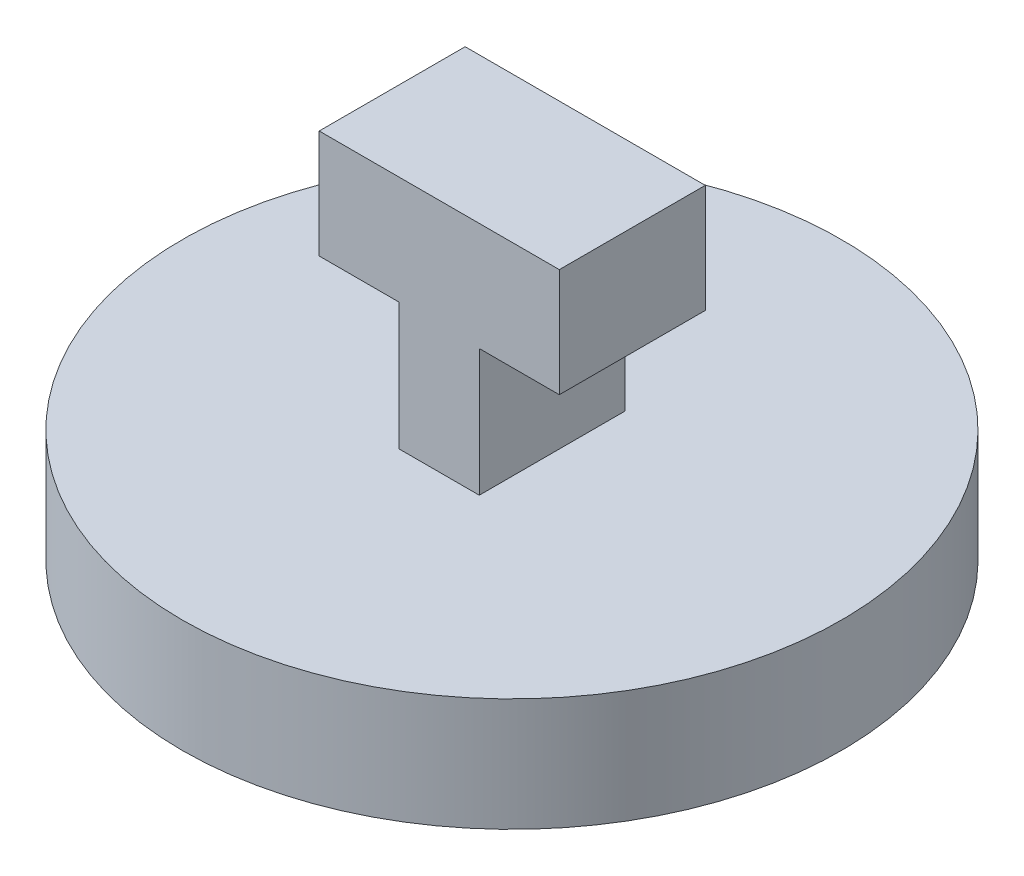
ISO-10303-21;
HEADER;
FILE_DESCRIPTION(('STEP AP214'),'2;1');
FILE_NAME('part.step','',(''),(''),'','','');
FILE_SCHEMA(('AUTOMOTIVE_DESIGN { 1 0 10303 214 1 1 1 1 }'));
ENDSEC;
DATA;
#1=APPLICATION_CONTEXT('core data for automotive mechanical design processes');
#2=APPLICATION_PROTOCOL_DEFINITION('international standard','automotive_design',2000,#1);
#3=PRODUCT_CONTEXT('',#1,'mechanical');
#4=PRODUCT('Part','Part','',(#3));
#5=PRODUCT_RELATED_PRODUCT_CATEGORY('part','',(#4));
#6=PRODUCT_DEFINITION_FORMATION('','',#4);
#7=PRODUCT_DEFINITION_CONTEXT('part definition',#1,'design');
#8=PRODUCT_DEFINITION('design','',#6,#7);
#9=PRODUCT_DEFINITION_SHAPE('','',#8);
#10=(LENGTH_UNIT() NAMED_UNIT(*) SI_UNIT(.MILLI.,.METRE.));
#11=(NAMED_UNIT(*) PLANE_ANGLE_UNIT() SI_UNIT($,.RADIAN.));
#12=(NAMED_UNIT(*) SI_UNIT($,.STERADIAN.) SOLID_ANGLE_UNIT());
#13=UNCERTAINTY_MEASURE_WITH_UNIT(LENGTH_MEASURE(1.E-05),#10,'distance_accuracy_value','');
#14=(GEOMETRIC_REPRESENTATION_CONTEXT(3) GLOBAL_UNCERTAINTY_ASSIGNED_CONTEXT((#13)) GLOBAL_UNIT_ASSIGNED_CONTEXT((#10,
#11,#12)) REPRESENTATION_CONTEXT('',''));
#15=CARTESIAN_POINT('',(0.,0.,0.));
#16=DIRECTION('',(0.,0.,1.));
#17=DIRECTION('',(1.,0.,0.));
#18=AXIS2_PLACEMENT_3D('',#15,#16,#17);
#19=CARTESIAN_POINT('',(0.,2.4,0.));
#20=DIRECTION('',(0.,1.,0.));
#21=DIRECTION('',(0.,0.,1.));
#22=AXIS2_PLACEMENT_3D('',#19,#20,#21);
#23=PLANE('',#22);
#24=CARTESIAN_POINT('',(0.,2.4,0.));
#25=DIRECTION('',(0.,1.,0.));
#26=DIRECTION('',(0.,0.,1.));
#27=AXIS2_PLACEMENT_3D('',#24,#25,#26);
#28=CIRCLE('',#27,7.);
#29=CARTESIAN_POINT('',(0.,2.4,7.));
#30=VERTEX_POINT('',#29);
#31=EDGE_CURVE('E13',#30,#30,#28,.T.);
#32=ORIENTED_EDGE('',*,*,#31,.T.);
#33=EDGE_LOOP('',(#32));
#34=FACE_BOUND('',#33,.T.);
#35=DIRECTION('',(-1.,0.,0.));
#36=VECTOR('',#35,1.);
#37=CARTESIAN_POINT('',(0.,2.4,-1.55));
#38=LINE('',#37,#36);
#39=CARTESIAN_POINT('',(0.856552512765914,2.4,-1.55));
#40=VERTEX_POINT('',#39);
#41=CARTESIAN_POINT('',(-0.843447487234086,2.4,-1.55));
#42=VERTEX_POINT('',#41);
#43=EDGE_CURVE('E173',#40,#42,#38,.T.);
#44=ORIENTED_EDGE('',*,*,#43,.F.);
#45=DIRECTION('',(0.,0.,1.));
#46=VECTOR('',#45,1.);
#47=CARTESIAN_POINT('',(0.856552512765914,2.4,-1.55));
#48=LINE('',#47,#46);
#49=CARTESIAN_POINT('',(0.856552512765914,2.4,1.55));
#50=VERTEX_POINT('',#49);
#51=EDGE_CURVE('E77',#40,#50,#48,.T.);
#52=ORIENTED_EDGE('',*,*,#51,.T.);
#53=DIRECTION('',(-1.,0.,0.));
#54=VECTOR('',#53,1.);
#55=CARTESIAN_POINT('',(0.,2.4,1.55));
#56=LINE('',#55,#54);
#57=CARTESIAN_POINT('',(-0.843447487234086,2.4,1.55));
#58=VERTEX_POINT('',#57);
#59=EDGE_CURVE('E82',#50,#58,#56,.T.);
#60=ORIENTED_EDGE('',*,*,#59,.T.);
#61=DIRECTION('',(0.,0.,1.));
#62=VECTOR('',#61,1.);
#63=CARTESIAN_POINT('',(-0.843447487234086,2.4,-1.55));
#64=LINE('',#63,#62);
#65=EDGE_CURVE('E197',#42,#58,#64,.T.);
#66=ORIENTED_EDGE('',*,*,#65,.F.);
#67=EDGE_LOOP('',(#44,#52,#60,#66));
#68=FACE_BOUND('',#67,.T.);
#69=ADVANCED_FACE('F61',(#34,#68),#23,.T.);
#70=CARTESIAN_POINT('',(0.,2.4,0.));
#71=DIRECTION('',(0.,-1.,0.));
#72=DIRECTION('',(0.,0.,-1.));
#73=AXIS2_PLACEMENT_3D('',#70,#71,#72);
#74=CYLINDRICAL_SURFACE('',#73,7.);
#75=ORIENTED_EDGE('',*,*,#31,.F.);
#76=EDGE_LOOP('',(#75));
#77=FACE_BOUND('',#76,.T.);
#78=CARTESIAN_POINT('',(0.,0.,0.));
#79=DIRECTION('',(0.,1.,0.));
#80=DIRECTION('',(0.,0.,1.));
#81=AXIS2_PLACEMENT_3D('',#78,#79,#80);
#82=CIRCLE('',#81,7.);
#83=CARTESIAN_POINT('',(0.,0.,7.));
#84=VERTEX_POINT('',#83);
#85=EDGE_CURVE('E65',#84,#84,#82,.T.);
#86=ORIENTED_EDGE('',*,*,#85,.T.);
#87=EDGE_LOOP('',(#86));
#88=FACE_BOUND('',#87,.T.);
#89=ADVANCED_FACE('F63',(#77,#88),#74,.T.);
#90=CARTESIAN_POINT('',(0.,0.,0.));
#91=DIRECTION('',(0.,1.,0.));
#92=DIRECTION('',(0.,0.,1.));
#93=AXIS2_PLACEMENT_3D('',#90,#91,#92);
#94=PLANE('',#93);
#95=ORIENTED_EDGE('',*,*,#85,.F.);
#96=EDGE_LOOP('',(#95));
#97=FACE_BOUND('',#96,.T.);
#98=ADVANCED_FACE('F243',(#97),#94,.F.);
#99=CARTESIAN_POINT('',(-0.843447487234086,0.,-1.55));
#100=DIRECTION('',(1.,0.,0.));
#101=DIRECTION('',(0.,0.,-1.));
#102=AXIS2_PLACEMENT_3D('',#99,#100,#101);
#103=PLANE('',#102);
#104=ORIENTED_EDGE('',*,*,#65,.T.);
#105=DIRECTION('',(0.,1.,0.));
#106=VECTOR('',#105,1.);
#107=CARTESIAN_POINT('',(-0.843447487234086,0.,1.55));
#108=LINE('',#107,#106);
#109=CARTESIAN_POINT('',(-0.843447487234086,5.1,1.55));
#110=VERTEX_POINT('',#109);
#111=EDGE_CURVE('E169',#58,#110,#108,.T.);
#112=ORIENTED_EDGE('',*,*,#111,.T.);
#113=DIRECTION('',(0.,0.,1.));
#114=VECTOR('',#113,1.);
#115=CARTESIAN_POINT('',(-0.843447487234086,5.1,-1.55));
#116=LINE('',#115,#114);
#117=CARTESIAN_POINT('',(-0.843447487234086,5.1,-1.55));
#118=VERTEX_POINT('',#117);
#119=EDGE_CURVE('E200',#118,#110,#116,.T.);
#120=ORIENTED_EDGE('',*,*,#119,.F.);
#121=DIRECTION('',(0.,1.,0.));
#122=VECTOR('',#121,1.);
#123=CARTESIAN_POINT('',(-0.843447487234086,0.,-1.55));
#124=LINE('',#123,#122);
#125=EDGE_CURVE('E194',#42,#118,#124,.T.);
#126=ORIENTED_EDGE('',*,*,#125,.F.);
#127=EDGE_LOOP('',(#104,#112,#120,#126));
#128=FACE_BOUND('',#127,.T.);
#129=ADVANCED_FACE('F245',(#128),#103,.F.);
#130=CARTESIAN_POINT('',(0.,5.1,-1.55));
#131=DIRECTION('',(0.,1.,0.));
#132=DIRECTION('',(0.,0.,1.));
#133=AXIS2_PLACEMENT_3D('',#130,#131,#132);
#134=PLANE('',#133);
#135=ORIENTED_EDGE('',*,*,#119,.T.);
#136=DIRECTION('',(-1.,0.,0.));
#137=VECTOR('',#136,1.);
#138=CARTESIAN_POINT('',(0.,5.1,1.55));
#139=LINE('',#138,#137);
#140=CARTESIAN_POINT('',(-2.54344748723409,5.1,1.55));
#141=VERTEX_POINT('',#140);
#142=EDGE_CURVE('E165',#110,#141,#139,.T.);
#143=ORIENTED_EDGE('',*,*,#142,.T.);
#144=DIRECTION('',(0.,0.,1.));
#145=VECTOR('',#144,1.);
#146=CARTESIAN_POINT('',(-2.54344748723409,5.1,-1.55));
#147=LINE('',#146,#145);
#148=CARTESIAN_POINT('',(-2.54344748723409,5.1,-1.55));
#149=VERTEX_POINT('',#148);
#150=EDGE_CURVE('E203',#149,#141,#147,.T.);
#151=ORIENTED_EDGE('',*,*,#150,.F.);
#152=DIRECTION('',(-1.,0.,0.));
#153=VECTOR('',#152,1.);
#154=CARTESIAN_POINT('',(0.,5.1,-1.55));
#155=LINE('',#154,#153);
#156=EDGE_CURVE('E191',#118,#149,#155,.T.);
#157=ORIENTED_EDGE('',*,*,#156,.F.);
#158=EDGE_LOOP('',(#135,#143,#151,#157));
#159=FACE_BOUND('',#158,.T.);
#160=ADVANCED_FACE('F250',(#159),#134,.F.);
#161=CARTESIAN_POINT('',(-2.54344748723409,0.,-1.55));
#162=DIRECTION('',(1.,0.,0.));
#163=DIRECTION('',(0.,0.,-1.));
#164=AXIS2_PLACEMENT_3D('',#161,#162,#163);
#165=PLANE('',#164);
#166=ORIENTED_EDGE('',*,*,#150,.T.);
#167=DIRECTION('',(0.,1.,0.));
#168=VECTOR('',#167,1.);
#169=CARTESIAN_POINT('',(-2.54344748723409,0.,1.55));
#170=LINE('',#169,#168);
#171=CARTESIAN_POINT('',(-2.54344748723409,7.4,1.55));
#172=VERTEX_POINT('',#171);
#173=EDGE_CURVE('E161',#141,#172,#170,.T.);
#174=ORIENTED_EDGE('',*,*,#173,.T.);
#175=DIRECTION('',(0.,0.,1.));
#176=VECTOR('',#175,1.);
#177=CARTESIAN_POINT('',(-2.54344748723409,7.4,-1.55));
#178=LINE('',#177,#176);
#179=CARTESIAN_POINT('',(-2.54344748723409,7.4,-1.55));
#180=VERTEX_POINT('',#179);
#181=EDGE_CURVE('E206',#180,#172,#178,.T.);
#182=ORIENTED_EDGE('',*,*,#181,.F.);
#183=DIRECTION('',(0.,1.,0.));
#184=VECTOR('',#183,1.);
#185=CARTESIAN_POINT('',(-2.54344748723409,0.,-1.55));
#186=LINE('',#185,#184);
#187=EDGE_CURVE('E188',#149,#180,#186,.T.);
#188=ORIENTED_EDGE('',*,*,#187,.F.);
#189=EDGE_LOOP('',(#166,#174,#182,#188));
#190=FACE_BOUND('',#189,.T.);
#191=ADVANCED_FACE('F272',(#190),#165,.F.);
#192=CARTESIAN_POINT('',(0.,7.4,-1.55));
#193=DIRECTION('',(0.,-1.,0.));
#194=DIRECTION('',(0.,0.,-1.));
#195=AXIS2_PLACEMENT_3D('',#192,#193,#194);
#196=PLANE('',#195);
#197=ORIENTED_EDGE('',*,*,#181,.T.);
#198=DIRECTION('',(1.,0.,0.));
#199=VECTOR('',#198,1.);
#200=CARTESIAN_POINT('',(0.,7.4,1.55));
#201=LINE('',#200,#199);
#202=CARTESIAN_POINT('',(2.55655251276591,7.4,1.55));
#203=VERTEX_POINT('',#202);
#204=EDGE_CURVE('E154',#172,#203,#201,.T.);
#205=ORIENTED_EDGE('',*,*,#204,.T.);
#206=DIRECTION('',(0.,0.,1.));
#207=VECTOR('',#206,1.);
#208=CARTESIAN_POINT('',(2.55655251276591,7.4,-1.55));
#209=LINE('',#208,#207);
#210=CARTESIAN_POINT('',(2.55655251276591,7.4,-1.55));
#211=VERTEX_POINT('',#210);
#212=EDGE_CURVE('E209',#211,#203,#209,.T.);
#213=ORIENTED_EDGE('',*,*,#212,.F.);
#214=DIRECTION('',(1.,0.,0.));
#215=VECTOR('',#214,1.);
#216=CARTESIAN_POINT('',(0.,7.4,-1.55));
#217=LINE('',#216,#215);
#218=EDGE_CURVE('E185',#180,#211,#217,.T.);
#219=ORIENTED_EDGE('',*,*,#218,.F.);
#220=EDGE_LOOP('',(#197,#205,#213,#219));
#221=FACE_BOUND('',#220,.T.);
#222=ADVANCED_FACE('F268',(#221),#196,.F.);
#223=CARTESIAN_POINT('',(2.55655251276591,0.,-1.55));
#224=DIRECTION('',(-1.,0.,0.));
#225=DIRECTION('',(0.,-1.,0.));
#226=AXIS2_PLACEMENT_3D('',#223,#224,#225);
#227=PLANE('',#226);
#228=ORIENTED_EDGE('',*,*,#212,.T.);
#229=DIRECTION('',(0.,-1.,0.));
#230=VECTOR('',#229,1.);
#231=CARTESIAN_POINT('',(2.55655251276591,0.,1.55));
#232=LINE('',#231,#230);
#233=CARTESIAN_POINT('',(2.55655251276591,5.09860171877088,1.55));
#234=VERTEX_POINT('',#233);
#235=EDGE_CURVE('E150',#203,#234,#232,.T.);
#236=ORIENTED_EDGE('',*,*,#235,.T.);
#237=DIRECTION('',(0.,0.,1.));
#238=VECTOR('',#237,1.);
#239=CARTESIAN_POINT('',(2.55655251276591,5.09860171877088,-1.55));
#240=LINE('',#239,#238);
#241=CARTESIAN_POINT('',(2.55655251276591,5.09860171877088,-1.55));
#242=VERTEX_POINT('',#241);
#243=EDGE_CURVE('E136',#242,#234,#240,.T.);
#244=ORIENTED_EDGE('',*,*,#243,.F.);
#245=DIRECTION('',(0.,-1.,0.));
#246=VECTOR('',#245,1.);
#247=CARTESIAN_POINT('',(2.55655251276591,0.,-1.55));
#248=LINE('',#247,#246);
#249=EDGE_CURVE('E182',#211,#242,#248,.T.);
#250=ORIENTED_EDGE('',*,*,#249,.F.);
#251=EDGE_LOOP('',(#228,#236,#244,#250));
#252=FACE_BOUND('',#251,.T.);
#253=ADVANCED_FACE('F265',(#252),#227,.F.);
#254=CARTESIAN_POINT('',(0.,5.09860171877088,-1.55));
#255=DIRECTION('',(0.,1.,0.));
#256=DIRECTION('',(0.,0.,1.));
#257=AXIS2_PLACEMENT_3D('',#254,#255,#256);
#258=PLANE('',#257);
#259=ORIENTED_EDGE('',*,*,#243,.T.);
#260=DIRECTION('',(-1.,0.,0.));
#261=VECTOR('',#260,1.);
#262=CARTESIAN_POINT('',(0.,5.09860171877088,1.55));
#263=LINE('',#262,#261);
#264=CARTESIAN_POINT('',(0.856552512765914,5.09860171877088,1.55));
#265=VERTEX_POINT('',#264);
#266=EDGE_CURVE('E142',#234,#265,#263,.T.);
#267=ORIENTED_EDGE('',*,*,#266,.T.);
#268=DIRECTION('',(0.,0.,1.));
#269=VECTOR('',#268,1.);
#270=CARTESIAN_POINT('',(0.856552512765914,5.09860171877088,-1.55));
#271=LINE('',#270,#269);
#272=CARTESIAN_POINT('',(0.856552512765914,5.09860171877088,-1.55));
#273=VERTEX_POINT('',#272);
#274=EDGE_CURVE('E126',#273,#265,#271,.T.);
#275=ORIENTED_EDGE('',*,*,#274,.F.);
#276=DIRECTION('',(-1.,0.,0.));
#277=VECTOR('',#276,1.);
#278=CARTESIAN_POINT('',(0.,5.09860171877088,-1.55));
#279=LINE('',#278,#277);
#280=EDGE_CURVE('E179',#242,#273,#279,.T.);
#281=ORIENTED_EDGE('',*,*,#280,.F.);
#282=EDGE_LOOP('',(#259,#267,#275,#281));
#283=FACE_BOUND('',#282,.T.);
#284=ADVANCED_FACE('F147',(#283),#258,.F.);
#285=CARTESIAN_POINT('',(0.856552512765914,0.,-1.55));
#286=DIRECTION('',(1.,0.,0.));
#287=DIRECTION('',(0.,0.,-1.));
#288=AXIS2_PLACEMENT_3D('',#285,#286,#287);
#289=PLANE('',#288);
#290=ORIENTED_EDGE('',*,*,#274,.T.);
#291=DIRECTION('',(0.,1.,0.));
#292=VECTOR('',#291,1.);
#293=CARTESIAN_POINT('',(0.856552512765914,0.,1.55));
#294=LINE('',#293,#292);
#295=EDGE_CURVE('E129',#50,#265,#294,.T.);
#296=ORIENTED_EDGE('',*,*,#295,.F.);
#297=ORIENTED_EDGE('',*,*,#51,.F.);
#298=DIRECTION('',(0.,1.,0.));
#299=VECTOR('',#298,1.);
#300=CARTESIAN_POINT('',(0.856552512765914,0.,-1.55));
#301=LINE('',#300,#299);
#302=EDGE_CURVE('E131',#40,#273,#301,.T.);
#303=ORIENTED_EDGE('',*,*,#302,.T.);
#304=EDGE_LOOP('',(#290,#296,#297,#303));
#305=FACE_BOUND('',#304,.T.);
#306=ADVANCED_FACE('F128',(#305),#289,.T.);
#307=CARTESIAN_POINT('',(0.,0.,-1.55));
#308=DIRECTION('',(0.,0.,1.));
#309=DIRECTION('',(1.,0.,0.));
#310=AXIS2_PLACEMENT_3D('',#307,#308,#309);
#311=PLANE('',#310);
#312=ORIENTED_EDGE('',*,*,#43,.T.);
#313=ORIENTED_EDGE('',*,*,#125,.T.);
#314=ORIENTED_EDGE('',*,*,#156,.T.);
#315=ORIENTED_EDGE('',*,*,#187,.T.);
#316=ORIENTED_EDGE('',*,*,#218,.T.);
#317=ORIENTED_EDGE('',*,*,#249,.T.);
#318=ORIENTED_EDGE('',*,*,#280,.T.);
#319=ORIENTED_EDGE('',*,*,#302,.F.);
#320=EDGE_LOOP('',(#312,#313,#314,#315,#316,#317,#318,#319));
#321=FACE_BOUND('',#320,.T.);
#322=ADVANCED_FACE('F262',(#321),#311,.F.);
#323=CARTESIAN_POINT('',(0.,0.,1.55));
#324=DIRECTION('',(0.,0.,1.));
#325=DIRECTION('',(1.,0.,0.));
#326=AXIS2_PLACEMENT_3D('',#323,#324,#325);
#327=PLANE('',#326);
#328=ORIENTED_EDGE('',*,*,#59,.F.);
#329=ORIENTED_EDGE('',*,*,#295,.T.);
#330=ORIENTED_EDGE('',*,*,#266,.F.);
#331=ORIENTED_EDGE('',*,*,#235,.F.);
#332=ORIENTED_EDGE('',*,*,#204,.F.);
#333=ORIENTED_EDGE('',*,*,#173,.F.);
#334=ORIENTED_EDGE('',*,*,#142,.F.);
#335=ORIENTED_EDGE('',*,*,#111,.F.);
#336=EDGE_LOOP('',(#328,#329,#330,#331,#332,#333,#334,#335));
#337=FACE_BOUND('',#336,.T.);
#338=ADVANCED_FACE('F140',(#337),#327,.T.);
#339=CLOSED_SHELL('',(#69,#89,#98,#129,#160,#191,#222,#253,#284,#306,#322,#338));
#340=MANIFOLD_SOLID_BREP('B2',#339);
#341=ADVANCED_BREP_SHAPE_REPRESENTATION('',(#18,#340),#14);
#342=SHAPE_DEFINITION_REPRESENTATION(#9,#341);
ENDSEC;
END-ISO-10303-21;
